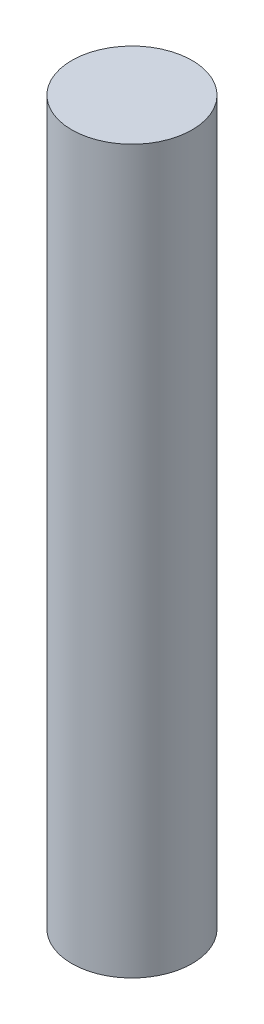
ISO-10303-21;
HEADER;
FILE_DESCRIPTION(('STEP AP214'),'2;1');
FILE_NAME('part.step','',(''),(''),'','','');
FILE_SCHEMA(('AUTOMOTIVE_DESIGN { 1 0 10303 214 1 1 1 1 }'));
ENDSEC;
DATA;
#1=APPLICATION_CONTEXT('core data for automotive mechanical design processes');
#2=APPLICATION_PROTOCOL_DEFINITION('international standard','automotive_design',2000,#1);
#3=PRODUCT_CONTEXT('',#1,'mechanical');
#4=PRODUCT('Part','Part','',(#3));
#5=PRODUCT_RELATED_PRODUCT_CATEGORY('part','',(#4));
#6=PRODUCT_DEFINITION_FORMATION('','',#4);
#7=PRODUCT_DEFINITION_CONTEXT('part definition',#1,'design');
#8=PRODUCT_DEFINITION('design','',#6,#7);
#9=PRODUCT_DEFINITION_SHAPE('','',#8);
#10=(LENGTH_UNIT() NAMED_UNIT(*) SI_UNIT(.MILLI.,.METRE.));
#11=(NAMED_UNIT(*) PLANE_ANGLE_UNIT() SI_UNIT($,.RADIAN.));
#12=(NAMED_UNIT(*) SI_UNIT($,.STERADIAN.) SOLID_ANGLE_UNIT());
#13=UNCERTAINTY_MEASURE_WITH_UNIT(LENGTH_MEASURE(1.E-05),#10,'distance_accuracy_value','');
#14=(GEOMETRIC_REPRESENTATION_CONTEXT(3) GLOBAL_UNCERTAINTY_ASSIGNED_CONTEXT((#13)) GLOBAL_UNIT_ASSIGNED_CONTEXT((#10,
#11,#12)) REPRESENTATION_CONTEXT('',''));
#15=CARTESIAN_POINT('',(0.,0.,0.));
#16=DIRECTION('',(0.,0.,1.));
#17=DIRECTION('',(1.,0.,0.));
#18=AXIS2_PLACEMENT_3D('',#15,#16,#17);
#19=CARTESIAN_POINT('',(0.,15.,0.));
#20=DIRECTION('',(0.,-1.,0.));
#21=DIRECTION('',(0.,0.,-1.));
#22=AXIS2_PLACEMENT_3D('',#19,#20,#21);
#23=CYLINDRICAL_SURFACE('',#22,2.5);
#24=CARTESIAN_POINT('',(0.,15.,0.));
#25=DIRECTION('',(0.,1.,0.));
#26=DIRECTION('',(0.,0.,1.));
#27=AXIS2_PLACEMENT_3D('',#24,#25,#26);
#28=CIRCLE('',#27,2.5);
#29=CARTESIAN_POINT('',(0.,15.,2.5));
#30=VERTEX_POINT('',#29);
#31=EDGE_CURVE('E10',#30,#30,#28,.T.);
#32=ORIENTED_EDGE('',*,*,#31,.F.);
#33=EDGE_LOOP('',(#32));
#34=FACE_BOUND('',#33,.T.);
#35=CARTESIAN_POINT('',(0.,-15.,0.));
#36=DIRECTION('',(0.,1.,0.));
#37=DIRECTION('',(0.,0.,1.));
#38=AXIS2_PLACEMENT_3D('',#35,#36,#37);
#39=CIRCLE('',#38,2.5);
#40=CARTESIAN_POINT('',(0.,-15.,2.5));
#41=VERTEX_POINT('',#40);
#42=EDGE_CURVE('E44',#41,#41,#39,.T.);
#43=ORIENTED_EDGE('',*,*,#42,.T.);
#44=EDGE_LOOP('',(#43));
#45=FACE_BOUND('',#44,.T.);
#46=ADVANCED_FACE('F41',(#34,#45),#23,.T.);
#47=CARTESIAN_POINT('',(0.,15.,0.));
#48=DIRECTION('',(0.,1.,0.));
#49=DIRECTION('',(0.,0.,1.));
#50=AXIS2_PLACEMENT_3D('',#47,#48,#49);
#51=PLANE('',#50);
#52=ORIENTED_EDGE('',*,*,#31,.T.);
#53=EDGE_LOOP('',(#52));
#54=FACE_BOUND('',#53,.T.);
#55=ADVANCED_FACE('F56',(#54),#51,.T.);
#56=CARTESIAN_POINT('',(0.,-15.,0.));
#57=DIRECTION('',(0.,1.,0.));
#58=DIRECTION('',(0.,0.,1.));
#59=AXIS2_PLACEMENT_3D('',#56,#57,#58);
#60=PLANE('',#59);
#61=ORIENTED_EDGE('',*,*,#42,.F.);
#62=EDGE_LOOP('',(#61));
#63=FACE_BOUND('',#62,.T.);
#64=ADVANCED_FACE('F54',(#63),#60,.F.);
#65=CLOSED_SHELL('',(#46,#55,#64));
#66=MANIFOLD_SOLID_BREP('B2',#65);
#67=ADVANCED_BREP_SHAPE_REPRESENTATION('',(#18,#66),#14);
#68=SHAPE_DEFINITION_REPRESENTATION(#9,#67);
ENDSEC;
END-ISO-10303-21;
